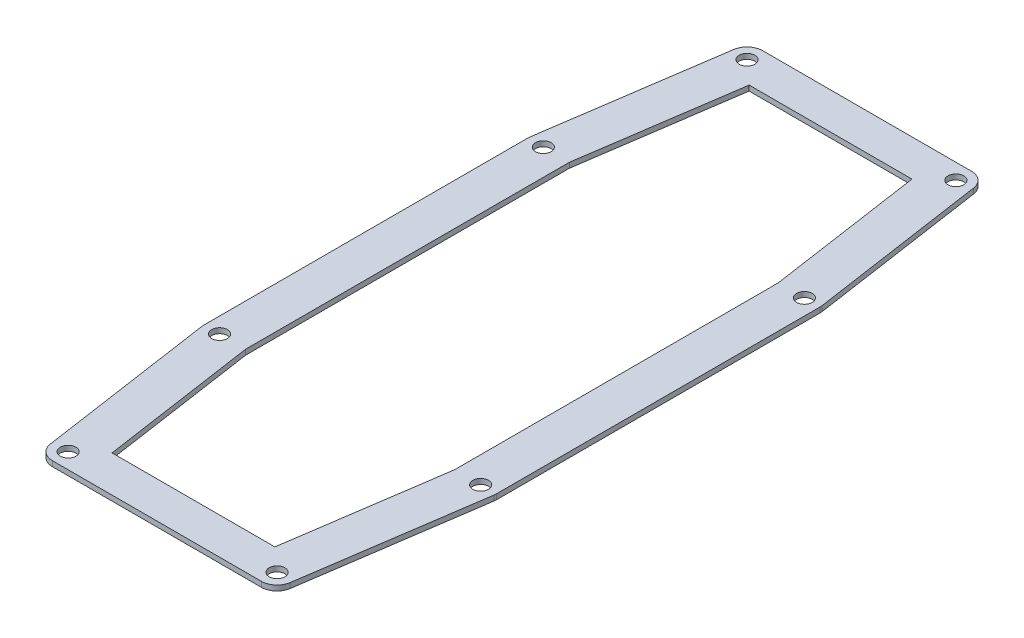
ISO-10303-21;
HEADER;
FILE_DESCRIPTION(('STEP AP214'),'2;1');
FILE_NAME('part.step','',(''),(''),'','','');
FILE_SCHEMA(('AUTOMOTIVE_DESIGN { 1 0 10303 214 1 1 1 1 }'));
ENDSEC;
DATA;
#1=APPLICATION_CONTEXT('core data for automotive mechanical design processes');
#2=APPLICATION_PROTOCOL_DEFINITION('international standard','automotive_design',2000,#1);
#3=PRODUCT_CONTEXT('',#1,'mechanical');
#4=PRODUCT('Part','Part','',(#3));
#5=PRODUCT_RELATED_PRODUCT_CATEGORY('part','',(#4));
#6=PRODUCT_DEFINITION_FORMATION('','',#4);
#7=PRODUCT_DEFINITION_CONTEXT('part definition',#1,'design');
#8=PRODUCT_DEFINITION('design','',#6,#7);
#9=PRODUCT_DEFINITION_SHAPE('','',#8);
#10=(LENGTH_UNIT() NAMED_UNIT(*) SI_UNIT(.MILLI.,.METRE.));
#11=(NAMED_UNIT(*) PLANE_ANGLE_UNIT() SI_UNIT($,.RADIAN.));
#12=(NAMED_UNIT(*) SI_UNIT($,.STERADIAN.) SOLID_ANGLE_UNIT());
#13=UNCERTAINTY_MEASURE_WITH_UNIT(LENGTH_MEASURE(1.E-05),#10,'distance_accuracy_value','');
#14=(GEOMETRIC_REPRESENTATION_CONTEXT(3) GLOBAL_UNCERTAINTY_ASSIGNED_CONTEXT((#13)) GLOBAL_UNIT_ASSIGNED_CONTEXT((#10,
#11,#12)) REPRESENTATION_CONTEXT('',''));
#15=CARTESIAN_POINT('',(0.,0.,0.));
#16=DIRECTION('',(0.,0.,1.));
#17=DIRECTION('',(1.,0.,0.));
#18=AXIS2_PLACEMENT_3D('',#15,#16,#17);
#19=CARTESIAN_POINT('',(45.,1.,34.));
#20=DIRECTION('',(0.,-1.,0.));
#21=DIRECTION('',(0.,0.,-1.));
#22=AXIS2_PLACEMENT_3D('',#19,#20,#21);
#23=PLANE('',#22);
#24=CARTESIAN_POINT('',(45.,1.,34.));
#25=DIRECTION('',(0.,1.,0.));
#26=DIRECTION('',(0.,0.,1.));
#27=AXIS2_PLACEMENT_3D('',#24,#25,#26);
#28=CIRCLE('',#27,1.5);
#29=CARTESIAN_POINT('',(45.,1.,35.5));
#30=VERTEX_POINT('',#29);
#31=EDGE_CURVE('E262',#30,#30,#28,.T.);
#32=ORIENTED_EDGE('',*,*,#31,.F.);
#33=EDGE_LOOP('',(#32));
#34=FACE_BOUND('',#33,.T.);
#35=CARTESIAN_POINT('',(5.00000000000002,1.,34.));
#36=DIRECTION('',(0.,1.,0.));
#37=DIRECTION('',(0.,0.,1.));
#38=AXIS2_PLACEMENT_3D('',#35,#36,#37);
#39=CIRCLE('',#38,1.5);
#40=CARTESIAN_POINT('',(5.00000000000002,1.,35.5));
#41=VERTEX_POINT('',#40);
#42=EDGE_CURVE('E268',#41,#41,#39,.T.);
#43=ORIENTED_EDGE('',*,*,#42,.F.);
#44=EDGE_LOOP('',(#43));
#45=FACE_BOUND('',#44,.T.);
#46=CARTESIAN_POINT('',(45.,1.,-96.));
#47=DIRECTION('',(0.,1.,0.));
#48=DIRECTION('',(0.,0.,1.));
#49=AXIS2_PLACEMENT_3D('',#46,#47,#48);
#50=CIRCLE('',#49,1.5);
#51=CARTESIAN_POINT('',(45.,1.,-94.5));
#52=VERTEX_POINT('',#51);
#53=EDGE_CURVE('E274',#52,#52,#50,.T.);
#54=ORIENTED_EDGE('',*,*,#53,.F.);
#55=EDGE_LOOP('',(#54));
#56=FACE_BOUND('',#55,.T.);
#57=CARTESIAN_POINT('',(5.,1.,-96.));
#58=DIRECTION('',(0.,1.,0.));
#59=DIRECTION('',(0.,0.,1.));
#60=AXIS2_PLACEMENT_3D('',#57,#58,#59);
#61=CIRCLE('',#60,1.5);
#62=CARTESIAN_POINT('',(5.,1.,-94.5));
#63=VERTEX_POINT('',#62);
#64=EDGE_CURVE('E280',#63,#63,#61,.T.);
#65=ORIENTED_EDGE('',*,*,#64,.F.);
#66=EDGE_LOOP('',(#65));
#67=FACE_BOUND('',#66,.T.);
#68=CARTESIAN_POINT('',(50.,1.,0.));
#69=DIRECTION('',(0.,1.,0.));
#70=DIRECTION('',(0.,0.,1.));
#71=AXIS2_PLACEMENT_3D('',#68,#69,#70);
#72=CIRCLE('',#71,1.5);
#73=CARTESIAN_POINT('',(50.,1.,1.5));
#74=VERTEX_POINT('',#73);
#75=EDGE_CURVE('E286',#74,#74,#72,.T.);
#76=ORIENTED_EDGE('',*,*,#75,.F.);
#77=EDGE_LOOP('',(#76));
#78=FACE_BOUND('',#77,.T.);
#79=CARTESIAN_POINT('',(0.,1.,0.));
#80=DIRECTION('',(0.,1.,0.));
#81=DIRECTION('',(0.,0.,1.));
#82=AXIS2_PLACEMENT_3D('',#79,#80,#81);
#83=CIRCLE('',#82,1.5);
#84=CARTESIAN_POINT('',(0.,1.,1.5));
#85=VERTEX_POINT('',#84);
#86=EDGE_CURVE('E292',#85,#85,#83,.T.);
#87=ORIENTED_EDGE('',*,*,#86,.F.);
#88=EDGE_LOOP('',(#87));
#89=FACE_BOUND('',#88,.T.);
#90=CARTESIAN_POINT('',(50.,1.,-62.));
#91=DIRECTION('',(0.,1.,0.));
#92=DIRECTION('',(0.,0.,1.));
#93=AXIS2_PLACEMENT_3D('',#90,#91,#92);
#94=CIRCLE('',#93,1.5);
#95=CARTESIAN_POINT('',(50.,1.,-60.5));
#96=VERTEX_POINT('',#95);
#97=EDGE_CURVE('E298',#96,#96,#94,.T.);
#98=ORIENTED_EDGE('',*,*,#97,.F.);
#99=EDGE_LOOP('',(#98));
#100=FACE_BOUND('',#99,.T.);
#101=CARTESIAN_POINT('',(0.,1.,-62.));
#102=DIRECTION('',(0.,1.,0.));
#103=DIRECTION('',(0.,0.,1.));
#104=AXIS2_PLACEMENT_3D('',#101,#102,#103);
#105=CIRCLE('',#104,1.5);
#106=CARTESIAN_POINT('',(0.,1.,-60.5));
#107=VERTEX_POINT('',#106);
#108=EDGE_CURVE('E304',#107,#107,#105,.T.);
#109=ORIENTED_EDGE('',*,*,#108,.F.);
#110=EDGE_LOOP('',(#109));
#111=FACE_BOUND('',#110,.T.);
#112=CARTESIAN_POINT('',(45.,1.,34.));
#113=DIRECTION('',(0.,1.,0.));
#114=DIRECTION('',(0.,0.,-1.));
#115=AXIS2_PLACEMENT_3D('',#112,#113,#114);
#116=CIRCLE('',#115,2.99999999999999);
#117=CARTESIAN_POINT('',(45.,1.,37.));
#118=VERTEX_POINT('',#117);
#119=CARTESIAN_POINT('',(47.9680774060946,1.,34.4364819714845));
#120=VERTEX_POINT('',#119);
#121=EDGE_CURVE('E310',#118,#120,#116,.T.);
#122=ORIENTED_EDGE('',*,*,#121,.T.);
#123=DIRECTION('',(0.145493990494832,0.,-0.989359135364853));
#124=VECTOR('',#123,1.);
#125=CARTESIAN_POINT('',(52.9680774060946,1.,0.436481971484495));
#126=LINE('',#125,#124);
#127=CARTESIAN_POINT('',(52.9680774060946,1.,0.436481971484495));
#128=VERTEX_POINT('',#127);
#129=EDGE_CURVE('E313',#120,#128,#126,.T.);
#130=ORIENTED_EDGE('',*,*,#129,.T.);
#131=CARTESIAN_POINT('',(50.,1.,0.));
#132=DIRECTION('',(0.,1.,0.));
#133=DIRECTION('',(0.,0.,-1.));
#134=AXIS2_PLACEMENT_3D('',#131,#132,#133);
#135=CIRCLE('',#134,3.);
#136=CARTESIAN_POINT('',(53.,1.,0.));
#137=VERTEX_POINT('',#136);
#138=EDGE_CURVE('E316',#128,#137,#135,.T.);
#139=ORIENTED_EDGE('',*,*,#138,.T.);
#140=DIRECTION('',(0.,0.,-1.));
#141=VECTOR('',#140,1.);
#142=CARTESIAN_POINT('',(53.,1.,-62.));
#143=LINE('',#142,#141);
#144=CARTESIAN_POINT('',(53.,1.,-62.));
#145=VERTEX_POINT('',#144);
#146=EDGE_CURVE('E318',#137,#145,#143,.T.);
#147=ORIENTED_EDGE('',*,*,#146,.T.);
#148=CARTESIAN_POINT('',(50.,1.,-62.));
#149=DIRECTION('',(0.,1.,0.));
#150=DIRECTION('',(0.,0.,-1.));
#151=AXIS2_PLACEMENT_3D('',#148,#149,#150);
#152=CIRCLE('',#151,2.99999999999999);
#153=CARTESIAN_POINT('',(52.9680774060946,1.,-62.4364819714845));
#154=VERTEX_POINT('',#153);
#155=EDGE_CURVE('E320',#145,#154,#152,.T.);
#156=ORIENTED_EDGE('',*,*,#155,.T.);
#157=DIRECTION('',(-0.145493990494831,0.,-0.989359135364853));
#158=VECTOR('',#157,1.);
#159=CARTESIAN_POINT('',(47.9680774060946,1.,-96.4364819714845));
#160=LINE('',#159,#158);
#161=CARTESIAN_POINT('',(47.9680774060946,1.,-96.4364819714845));
#162=VERTEX_POINT('',#161);
#163=EDGE_CURVE('E322',#154,#162,#160,.T.);
#164=ORIENTED_EDGE('',*,*,#163,.T.);
#165=CARTESIAN_POINT('',(45.,1.,-96.));
#166=DIRECTION('',(0.,1.,0.));
#167=DIRECTION('',(0.,0.,-1.));
#168=AXIS2_PLACEMENT_3D('',#165,#166,#167);
#169=CIRCLE('',#168,3.);
#170=CARTESIAN_POINT('',(45.,1.,-99.));
#171=VERTEX_POINT('',#170);
#172=EDGE_CURVE('E324',#162,#171,#169,.T.);
#173=ORIENTED_EDGE('',*,*,#172,.T.);
#174=DIRECTION('',(-1.,0.,0.));
#175=VECTOR('',#174,1.);
#176=CARTESIAN_POINT('',(5.,1.,-99.));
#177=LINE('',#176,#175);
#178=CARTESIAN_POINT('',(5.,1.,-99.));
#179=VERTEX_POINT('',#178);
#180=EDGE_CURVE('E326',#171,#179,#177,.T.);
#181=ORIENTED_EDGE('',*,*,#180,.T.);
#182=CARTESIAN_POINT('',(5.,1.,-96.));
#183=DIRECTION('',(0.,1.,0.));
#184=DIRECTION('',(0.,0.,1.));
#185=AXIS2_PLACEMENT_3D('',#182,#183,#184);
#186=CIRCLE('',#185,3.00000000000001);
#187=CARTESIAN_POINT('',(2.03192259390543,1.,-96.4364819714845));
#188=VERTEX_POINT('',#187);
#189=EDGE_CURVE('E328',#179,#188,#186,.T.);
#190=ORIENTED_EDGE('',*,*,#189,.T.);
#191=DIRECTION('',(-0.145493990494831,0.,0.989359135364853));
#192=VECTOR('',#191,1.);
#193=CARTESIAN_POINT('',(2.03192259390544,1.,-96.4364819714845));
#194=LINE('',#193,#192);
#195=CARTESIAN_POINT('',(-2.96807740609456,1.,-62.4364819714845));
#196=VERTEX_POINT('',#195);
#197=EDGE_CURVE('E330',#188,#196,#194,.T.);
#198=ORIENTED_EDGE('',*,*,#197,.T.);
#199=CARTESIAN_POINT('',(0.,1.,-62.));
#200=DIRECTION('',(0.,1.,0.));
#201=DIRECTION('',(0.,0.,1.));
#202=AXIS2_PLACEMENT_3D('',#199,#200,#201);
#203=CIRCLE('',#202,3.);
#204=CARTESIAN_POINT('',(-3.,1.,-62.));
#205=VERTEX_POINT('',#204);
#206=EDGE_CURVE('E332',#196,#205,#203,.T.);
#207=ORIENTED_EDGE('',*,*,#206,.T.);
#208=DIRECTION('',(0.,0.,1.));
#209=VECTOR('',#208,1.);
#210=CARTESIAN_POINT('',(-3.,1.,-62.));
#211=LINE('',#210,#209);
#212=CARTESIAN_POINT('',(-3.,1.,0.));
#213=VERTEX_POINT('',#212);
#214=EDGE_CURVE('E334',#205,#213,#211,.T.);
#215=ORIENTED_EDGE('',*,*,#214,.T.);
#216=CARTESIAN_POINT('',(0.,1.,0.));
#217=DIRECTION('',(0.,1.,0.));
#218=DIRECTION('',(0.,0.,1.));
#219=AXIS2_PLACEMENT_3D('',#216,#217,#218);
#220=CIRCLE('',#219,3.);
#221=CARTESIAN_POINT('',(-2.96807740609456,1.,0.436481971484493));
#222=VERTEX_POINT('',#221);
#223=EDGE_CURVE('E336',#213,#222,#220,.T.);
#224=ORIENTED_EDGE('',*,*,#223,.T.);
#225=DIRECTION('',(0.145493990494832,0.,0.989359135364853));
#226=VECTOR('',#225,1.);
#227=CARTESIAN_POINT('',(-2.96807740609456,1.,0.436481971484495));
#228=LINE('',#227,#226);
#229=CARTESIAN_POINT('',(2.03192259390546,1.,34.4364819714845));
#230=VERTEX_POINT('',#229);
#231=EDGE_CURVE('E338',#222,#230,#228,.T.);
#232=ORIENTED_EDGE('',*,*,#231,.T.);
#233=CARTESIAN_POINT('',(5.00000000000002,1.,34.));
#234=DIRECTION('',(0.,1.,0.));
#235=DIRECTION('',(0.,0.,1.));
#236=AXIS2_PLACEMENT_3D('',#233,#234,#235);
#237=CIRCLE('',#236,3.);
#238=CARTESIAN_POINT('',(5.00000000000002,1.,37.));
#239=VERTEX_POINT('',#238);
#240=EDGE_CURVE('E340',#230,#239,#237,.T.);
#241=ORIENTED_EDGE('',*,*,#240,.T.);
#242=DIRECTION('',(1.,0.,0.));
#243=VECTOR('',#242,1.);
#244=CARTESIAN_POINT('',(5.00000000000002,1.,37.));
#245=LINE('',#244,#243);
#246=EDGE_CURVE('E342',#239,#118,#245,.T.);
#247=ORIENTED_EDGE('',*,*,#246,.T.);
#248=EDGE_LOOP('',(#122,#130,#139,#147,#156,#164,#173,#181,#190,#198,#207,#215,#224,#232,#241,#247));
#249=FACE_BOUND('',#248,.T.);
#250=DIRECTION('',(-1.,0.,0.));
#251=VECTOR('',#250,1.);
#252=CARTESIAN_POINT('',(9.41176470588236,1.,-92.));
#253=LINE('',#252,#251);
#254=CARTESIAN_POINT('',(40.5882352941176,1.,-92.));
#255=VERTEX_POINT('',#254);
#256=CARTESIAN_POINT('',(9.41176470588236,1.,-92.));
#257=VERTEX_POINT('',#256);
#258=EDGE_CURVE('E197',#255,#257,#253,.T.);
#259=ORIENTED_EDGE('',*,*,#258,.F.);
#260=DIRECTION('',(-0.145493990494832,0.,-0.989359135364853));
#261=VECTOR('',#260,1.);
#262=CARTESIAN_POINT('',(40.5882352941176,1.,-92.));
#263=LINE('',#262,#261);
#264=CARTESIAN_POINT('',(45.,1.,-62.));
#265=VERTEX_POINT('',#264);
#266=EDGE_CURVE('E230',#265,#255,#263,.T.);
#267=ORIENTED_EDGE('',*,*,#266,.F.);
#268=DIRECTION('',(0.,0.,-1.));
#269=VECTOR('',#268,1.);
#270=CARTESIAN_POINT('',(45.,1.,-62.));
#271=LINE('',#270,#269);
#272=CARTESIAN_POINT('',(45.,1.,0.));
#273=VERTEX_POINT('',#272);
#274=EDGE_CURVE('E228',#273,#265,#271,.T.);
#275=ORIENTED_EDGE('',*,*,#274,.F.);
#276=DIRECTION('',(0.145493990494831,0.,-0.989359135364853));
#277=VECTOR('',#276,1.);
#278=CARTESIAN_POINT('',(45.,1.,0.));
#279=LINE('',#278,#277);
#280=CARTESIAN_POINT('',(40.5882352941176,1.,30.));
#281=VERTEX_POINT('',#280);
#282=EDGE_CURVE('E226',#281,#273,#279,.T.);
#283=ORIENTED_EDGE('',*,*,#282,.F.);
#284=DIRECTION('',(1.,0.,0.));
#285=VECTOR('',#284,1.);
#286=CARTESIAN_POINT('',(9.41176470588238,1.,30.));
#287=LINE('',#286,#285);
#288=CARTESIAN_POINT('',(9.41176470588238,1.,30.));
#289=VERTEX_POINT('',#288);
#290=EDGE_CURVE('E224',#289,#281,#287,.T.);
#291=ORIENTED_EDGE('',*,*,#290,.F.);
#292=DIRECTION('',(0.145493990494832,0.,0.989359135364853));
#293=VECTOR('',#292,1.);
#294=CARTESIAN_POINT('',(5.00000000000002,1.,0.));
#295=LINE('',#294,#293);
#296=CARTESIAN_POINT('',(5.00000000000002,1.,0.));
#297=VERTEX_POINT('',#296);
#298=EDGE_CURVE('E220',#297,#289,#295,.T.);
#299=ORIENTED_EDGE('',*,*,#298,.F.);
#300=DIRECTION('',(0.,0.,1.));
#301=VECTOR('',#300,1.);
#302=CARTESIAN_POINT('',(5.,1.,-62.));
#303=LINE('',#302,#301);
#304=CARTESIAN_POINT('',(5.,1.,-62.));
#305=VERTEX_POINT('',#304);
#306=EDGE_CURVE('E218',#305,#297,#303,.T.);
#307=ORIENTED_EDGE('',*,*,#306,.F.);
#308=DIRECTION('',(-0.145493990494831,0.,0.989359135364853));
#309=VECTOR('',#308,1.);
#310=CARTESIAN_POINT('',(9.41176470588236,1.,-92.));
#311=LINE('',#310,#309);
#312=EDGE_CURVE('E205',#257,#305,#311,.T.);
#313=ORIENTED_EDGE('',*,*,#312,.F.);
#314=EDGE_LOOP('',(#259,#267,#275,#283,#291,#299,#307,#313));
#315=FACE_BOUND('',#314,.T.);
#316=ADVANCED_FACE('F36',(#34,#45,#56,#67,#78,#89,#100,#111,#249,#315),#23,.F.);
#317=CARTESIAN_POINT('',(45.,0.,34.));
#318=DIRECTION('',(0.,-1.,0.));
#319=DIRECTION('',(0.,0.,-1.));
#320=AXIS2_PLACEMENT_3D('',#317,#318,#319);
#321=PLANE('',#320);
#322=CARTESIAN_POINT('',(5.00000000000002,0.,34.));
#323=DIRECTION('',(0.,1.,0.));
#324=DIRECTION('',(0.,0.,1.));
#325=AXIS2_PLACEMENT_3D('',#322,#323,#324);
#326=CIRCLE('',#325,1.5);
#327=CARTESIAN_POINT('',(5.00000000000002,0.,35.5));
#328=VERTEX_POINT('',#327);
#329=EDGE_CURVE('E265',#328,#328,#326,.T.);
#330=ORIENTED_EDGE('',*,*,#329,.T.);
#331=EDGE_LOOP('',(#330));
#332=FACE_BOUND('',#331,.T.);
#333=CARTESIAN_POINT('',(5.,0.,-96.));
#334=DIRECTION('',(0.,1.,0.));
#335=DIRECTION('',(0.,0.,1.));
#336=AXIS2_PLACEMENT_3D('',#333,#334,#335);
#337=CIRCLE('',#336,1.5);
#338=CARTESIAN_POINT('',(5.,0.,-94.5));
#339=VERTEX_POINT('',#338);
#340=EDGE_CURVE('E277',#339,#339,#337,.T.);
#341=ORIENTED_EDGE('',*,*,#340,.T.);
#342=EDGE_LOOP('',(#341));
#343=FACE_BOUND('',#342,.T.);
#344=CARTESIAN_POINT('',(0.,0.,0.));
#345=DIRECTION('',(0.,1.,0.));
#346=DIRECTION('',(0.,0.,1.));
#347=AXIS2_PLACEMENT_3D('',#344,#345,#346);
#348=CIRCLE('',#347,1.5);
#349=CARTESIAN_POINT('',(0.,0.,1.5));
#350=VERTEX_POINT('',#349);
#351=EDGE_CURVE('E289',#350,#350,#348,.T.);
#352=ORIENTED_EDGE('',*,*,#351,.T.);
#353=EDGE_LOOP('',(#352));
#354=FACE_BOUND('',#353,.T.);
#355=CARTESIAN_POINT('',(0.,0.,-62.));
#356=DIRECTION('',(0.,1.,0.));
#357=DIRECTION('',(0.,0.,1.));
#358=AXIS2_PLACEMENT_3D('',#355,#356,#357);
#359=CIRCLE('',#358,1.5);
#360=CARTESIAN_POINT('',(0.,0.,-60.5));
#361=VERTEX_POINT('',#360);
#362=EDGE_CURVE('E301',#361,#361,#359,.T.);
#363=ORIENTED_EDGE('',*,*,#362,.T.);
#364=EDGE_LOOP('',(#363));
#365=FACE_BOUND('',#364,.T.);
#366=CARTESIAN_POINT('',(45.,0.,34.));
#367=DIRECTION('',(0.,1.,0.));
#368=DIRECTION('',(0.,0.,-1.));
#369=AXIS2_PLACEMENT_3D('',#366,#367,#368);
#370=CIRCLE('',#369,2.99999999999999);
#371=CARTESIAN_POINT('',(45.,0.,37.));
#372=VERTEX_POINT('',#371);
#373=CARTESIAN_POINT('',(47.9680774060946,0.,34.4364819714845));
#374=VERTEX_POINT('',#373);
#375=EDGE_CURVE('E307',#372,#374,#370,.T.);
#376=ORIENTED_EDGE('',*,*,#375,.F.);
#377=DIRECTION('',(1.,0.,0.));
#378=VECTOR('',#377,1.);
#379=CARTESIAN_POINT('',(5.00000000000002,0.,37.));
#380=LINE('',#379,#378);
#381=CARTESIAN_POINT('',(5.00000000000002,0.,37.));
#382=VERTEX_POINT('',#381);
#383=EDGE_CURVE('E314',#382,#372,#380,.T.);
#384=ORIENTED_EDGE('',*,*,#383,.F.);
#385=CARTESIAN_POINT('',(5.00000000000002,0.,34.));
#386=DIRECTION('',(0.,1.,0.));
#387=DIRECTION('',(0.,0.,1.));
#388=AXIS2_PLACEMENT_3D('',#385,#386,#387);
#389=CIRCLE('',#388,3.);
#390=CARTESIAN_POINT('',(2.03192259390546,0.,34.4364819714845));
#391=VERTEX_POINT('',#390);
#392=EDGE_CURVE('E373',#391,#382,#389,.T.);
#393=ORIENTED_EDGE('',*,*,#392,.F.);
#394=DIRECTION('',(0.145493990494832,0.,0.989359135364853));
#395=VECTOR('',#394,1.);
#396=CARTESIAN_POINT('',(-2.96807740609456,0.,0.436481971484495));
#397=LINE('',#396,#395);
#398=CARTESIAN_POINT('',(-2.96807740609456,0.,0.436481971484493));
#399=VERTEX_POINT('',#398);
#400=EDGE_CURVE('E371',#399,#391,#397,.T.);
#401=ORIENTED_EDGE('',*,*,#400,.F.);
#402=CARTESIAN_POINT('',(0.,0.,0.));
#403=DIRECTION('',(0.,1.,0.));
#404=DIRECTION('',(0.,0.,1.));
#405=AXIS2_PLACEMENT_3D('',#402,#403,#404);
#406=CIRCLE('',#405,3.);
#407=CARTESIAN_POINT('',(-3.,0.,0.));
#408=VERTEX_POINT('',#407);
#409=EDGE_CURVE('E369',#408,#399,#406,.T.);
#410=ORIENTED_EDGE('',*,*,#409,.F.);
#411=DIRECTION('',(0.,0.,1.));
#412=VECTOR('',#411,1.);
#413=CARTESIAN_POINT('',(-3.,0.,-62.));
#414=LINE('',#413,#412);
#415=CARTESIAN_POINT('',(-3.,0.,-62.));
#416=VERTEX_POINT('',#415);
#417=EDGE_CURVE('E367',#416,#408,#414,.T.);
#418=ORIENTED_EDGE('',*,*,#417,.F.);
#419=CARTESIAN_POINT('',(0.,0.,-62.));
#420=DIRECTION('',(0.,1.,0.));
#421=DIRECTION('',(0.,0.,1.));
#422=AXIS2_PLACEMENT_3D('',#419,#420,#421);
#423=CIRCLE('',#422,3.);
#424=CARTESIAN_POINT('',(-2.96807740609456,0.,-62.4364819714845));
#425=VERTEX_POINT('',#424);
#426=EDGE_CURVE('E365',#425,#416,#423,.T.);
#427=ORIENTED_EDGE('',*,*,#426,.F.);
#428=DIRECTION('',(-0.145493990494831,0.,0.989359135364853));
#429=VECTOR('',#428,1.);
#430=CARTESIAN_POINT('',(2.03192259390544,0.,-96.4364819714845));
#431=LINE('',#430,#429);
#432=CARTESIAN_POINT('',(2.03192259390543,0.,-96.4364819714845));
#433=VERTEX_POINT('',#432);
#434=EDGE_CURVE('E363',#433,#425,#431,.T.);
#435=ORIENTED_EDGE('',*,*,#434,.F.);
#436=CARTESIAN_POINT('',(5.,0.,-96.));
#437=DIRECTION('',(0.,1.,0.));
#438=DIRECTION('',(0.,0.,1.));
#439=AXIS2_PLACEMENT_3D('',#436,#437,#438);
#440=CIRCLE('',#439,3.00000000000001);
#441=CARTESIAN_POINT('',(5.,0.,-99.));
#442=VERTEX_POINT('',#441);
#443=EDGE_CURVE('E361',#442,#433,#440,.T.);
#444=ORIENTED_EDGE('',*,*,#443,.F.);
#445=DIRECTION('',(-1.,0.,0.));
#446=VECTOR('',#445,1.);
#447=CARTESIAN_POINT('',(5.,0.,-99.));
#448=LINE('',#447,#446);
#449=CARTESIAN_POINT('',(45.,0.,-99.));
#450=VERTEX_POINT('',#449);
#451=EDGE_CURVE('E359',#450,#442,#448,.T.);
#452=ORIENTED_EDGE('',*,*,#451,.F.);
#453=CARTESIAN_POINT('',(45.,0.,-96.));
#454=DIRECTION('',(0.,1.,0.));
#455=DIRECTION('',(0.,0.,-1.));
#456=AXIS2_PLACEMENT_3D('',#453,#454,#455);
#457=CIRCLE('',#456,3.);
#458=CARTESIAN_POINT('',(47.9680774060946,0.,-96.4364819714845));
#459=VERTEX_POINT('',#458);
#460=EDGE_CURVE('E357',#459,#450,#457,.T.);
#461=ORIENTED_EDGE('',*,*,#460,.F.);
#462=DIRECTION('',(-0.145493990494831,0.,-0.989359135364853));
#463=VECTOR('',#462,1.);
#464=CARTESIAN_POINT('',(47.9680774060946,0.,-96.4364819714845));
#465=LINE('',#464,#463);
#466=CARTESIAN_POINT('',(52.9680774060946,0.,-62.4364819714845));
#467=VERTEX_POINT('',#466);
#468=EDGE_CURVE('E355',#467,#459,#465,.T.);
#469=ORIENTED_EDGE('',*,*,#468,.F.);
#470=CARTESIAN_POINT('',(50.,0.,-62.));
#471=DIRECTION('',(0.,1.,0.));
#472=DIRECTION('',(0.,0.,-1.));
#473=AXIS2_PLACEMENT_3D('',#470,#471,#472);
#474=CIRCLE('',#473,2.99999999999999);
#475=CARTESIAN_POINT('',(53.,0.,-62.));
#476=VERTEX_POINT('',#475);
#477=EDGE_CURVE('E353',#476,#467,#474,.T.);
#478=ORIENTED_EDGE('',*,*,#477,.F.);
#479=DIRECTION('',(0.,0.,-1.));
#480=VECTOR('',#479,1.);
#481=CARTESIAN_POINT('',(53.,0.,-62.));
#482=LINE('',#481,#480);
#483=CARTESIAN_POINT('',(53.,0.,0.));
#484=VERTEX_POINT('',#483);
#485=EDGE_CURVE('E351',#484,#476,#482,.T.);
#486=ORIENTED_EDGE('',*,*,#485,.F.);
#487=CARTESIAN_POINT('',(50.,0.,0.));
#488=DIRECTION('',(0.,1.,0.));
#489=DIRECTION('',(0.,0.,-1.));
#490=AXIS2_PLACEMENT_3D('',#487,#488,#489);
#491=CIRCLE('',#490,3.);
#492=CARTESIAN_POINT('',(52.9680774060946,0.,0.436481971484495));
#493=VERTEX_POINT('',#492);
#494=EDGE_CURVE('E349',#493,#484,#491,.T.);
#495=ORIENTED_EDGE('',*,*,#494,.F.);
#496=DIRECTION('',(0.145493990494832,0.,-0.989359135364853));
#497=VECTOR('',#496,1.);
#498=CARTESIAN_POINT('',(52.9680774060946,0.,0.436481971484495));
#499=LINE('',#498,#497);
#500=EDGE_CURVE('E347',#374,#493,#499,.T.);
#501=ORIENTED_EDGE('',*,*,#500,.F.);
#502=EDGE_LOOP('',(#376,#384,#393,#401,#410,#418,#427,#435,#444,#452,#461,#469,#478,#486,#495,#501));
#503=FACE_BOUND('',#502,.T.);
#504=CARTESIAN_POINT('',(50.,0.,-62.));
#505=DIRECTION('',(0.,1.,0.));
#506=DIRECTION('',(0.,0.,1.));
#507=AXIS2_PLACEMENT_3D('',#504,#505,#506);
#508=CIRCLE('',#507,1.5);
#509=CARTESIAN_POINT('',(50.,0.,-60.5));
#510=VERTEX_POINT('',#509);
#511=EDGE_CURVE('E295',#510,#510,#508,.T.);
#512=ORIENTED_EDGE('',*,*,#511,.T.);
#513=EDGE_LOOP('',(#512));
#514=FACE_BOUND('',#513,.T.);
#515=CARTESIAN_POINT('',(50.,0.,0.));
#516=DIRECTION('',(0.,1.,0.));
#517=DIRECTION('',(0.,0.,1.));
#518=AXIS2_PLACEMENT_3D('',#515,#516,#517);
#519=CIRCLE('',#518,1.5);
#520=CARTESIAN_POINT('',(50.,0.,1.5));
#521=VERTEX_POINT('',#520);
#522=EDGE_CURVE('E283',#521,#521,#519,.T.);
#523=ORIENTED_EDGE('',*,*,#522,.T.);
#524=EDGE_LOOP('',(#523));
#525=FACE_BOUND('',#524,.T.);
#526=CARTESIAN_POINT('',(45.,0.,-96.));
#527=DIRECTION('',(0.,1.,0.));
#528=DIRECTION('',(0.,0.,1.));
#529=AXIS2_PLACEMENT_3D('',#526,#527,#528);
#530=CIRCLE('',#529,1.5);
#531=CARTESIAN_POINT('',(45.,0.,-94.5));
#532=VERTEX_POINT('',#531);
#533=EDGE_CURVE('E271',#532,#532,#530,.T.);
#534=ORIENTED_EDGE('',*,*,#533,.T.);
#535=EDGE_LOOP('',(#534));
#536=FACE_BOUND('',#535,.T.);
#537=CARTESIAN_POINT('',(45.,0.,34.));
#538=DIRECTION('',(0.,1.,0.));
#539=DIRECTION('',(0.,0.,1.));
#540=AXIS2_PLACEMENT_3D('',#537,#538,#539);
#541=CIRCLE('',#540,1.5);
#542=CARTESIAN_POINT('',(45.,0.,35.5));
#543=VERTEX_POINT('',#542);
#544=EDGE_CURVE('E213',#543,#543,#541,.T.);
#545=ORIENTED_EDGE('',*,*,#544,.T.);
#546=EDGE_LOOP('',(#545));
#547=FACE_BOUND('',#546,.T.);
#548=DIRECTION('',(-0.145493990494832,0.,-0.989359135364853));
#549=VECTOR('',#548,1.);
#550=CARTESIAN_POINT('',(40.5882352941176,0.,-92.));
#551=LINE('',#550,#549);
#552=CARTESIAN_POINT('',(45.,0.,-62.));
#553=VERTEX_POINT('',#552);
#554=CARTESIAN_POINT('',(40.5882352941176,0.,-92.));
#555=VERTEX_POINT('',#554);
#556=EDGE_CURVE('E206',#553,#555,#551,.T.);
#557=ORIENTED_EDGE('',*,*,#556,.T.);
#558=DIRECTION('',(-1.,0.,0.));
#559=VECTOR('',#558,1.);
#560=CARTESIAN_POINT('',(9.41176470588236,0.,-92.));
#561=LINE('',#560,#559);
#562=CARTESIAN_POINT('',(9.41176470588236,0.,-92.));
#563=VERTEX_POINT('',#562);
#564=EDGE_CURVE('E59',#555,#563,#561,.T.);
#565=ORIENTED_EDGE('',*,*,#564,.T.);
#566=DIRECTION('',(-0.145493990494831,0.,0.989359135364853));
#567=VECTOR('',#566,1.);
#568=CARTESIAN_POINT('',(9.41176470588236,0.,-92.));
#569=LINE('',#568,#567);
#570=CARTESIAN_POINT('',(5.,0.,-62.));
#571=VERTEX_POINT('',#570);
#572=EDGE_CURVE('E212',#563,#571,#569,.T.);
#573=ORIENTED_EDGE('',*,*,#572,.T.);
#574=DIRECTION('',(0.,0.,1.));
#575=VECTOR('',#574,1.);
#576=CARTESIAN_POINT('',(5.,0.,-62.));
#577=LINE('',#576,#575);
#578=CARTESIAN_POINT('',(5.00000000000002,0.,0.));
#579=VERTEX_POINT('',#578);
#580=EDGE_CURVE('E234',#571,#579,#577,.T.);
#581=ORIENTED_EDGE('',*,*,#580,.T.);
#582=DIRECTION('',(0.145493990494832,0.,0.989359135364853));
#583=VECTOR('',#582,1.);
#584=CARTESIAN_POINT('',(5.00000000000002,0.,0.));
#585=LINE('',#584,#583);
#586=CARTESIAN_POINT('',(9.41176470588238,0.,30.));
#587=VERTEX_POINT('',#586);
#588=EDGE_CURVE('E237',#579,#587,#585,.T.);
#589=ORIENTED_EDGE('',*,*,#588,.T.);
#590=DIRECTION('',(1.,0.,0.));
#591=VECTOR('',#590,1.);
#592=CARTESIAN_POINT('',(9.41176470588238,0.,30.));
#593=LINE('',#592,#591);
#594=CARTESIAN_POINT('',(40.5882352941176,0.,30.));
#595=VERTEX_POINT('',#594);
#596=EDGE_CURVE('E240',#587,#595,#593,.T.);
#597=ORIENTED_EDGE('',*,*,#596,.T.);
#598=DIRECTION('',(0.145493990494831,0.,-0.989359135364853));
#599=VECTOR('',#598,1.);
#600=CARTESIAN_POINT('',(45.,0.,0.));
#601=LINE('',#600,#599);
#602=CARTESIAN_POINT('',(45.,0.,0.));
#603=VERTEX_POINT('',#602);
#604=EDGE_CURVE('E243',#595,#603,#601,.T.);
#605=ORIENTED_EDGE('',*,*,#604,.T.);
#606=DIRECTION('',(0.,0.,-1.));
#607=VECTOR('',#606,1.);
#608=CARTESIAN_POINT('',(45.,0.,-62.));
#609=LINE('',#608,#607);
#610=EDGE_CURVE('E246',#603,#553,#609,.T.);
#611=ORIENTED_EDGE('',*,*,#610,.T.);
#612=EDGE_LOOP('',(#557,#565,#573,#581,#589,#597,#605,#611));
#613=FACE_BOUND('',#612,.T.);
#614=ADVANCED_FACE('F427',(#332,#343,#354,#365,#503,#514,#525,#536,#547,#613),#321,.T.);
#615=CARTESIAN_POINT('',(45.,1.,34.));
#616=DIRECTION('',(0.,-1.,0.));
#617=DIRECTION('',(0.,0.,-1.));
#618=AXIS2_PLACEMENT_3D('',#615,#616,#617);
#619=CYLINDRICAL_SURFACE('',#618,2.99999999999999);
#620=ORIENTED_EDGE('',*,*,#375,.T.);
#621=DIRECTION('',(0.,-1.,0.));
#622=VECTOR('',#621,1.);
#623=CARTESIAN_POINT('',(47.9680774060946,1.,34.4364819714845));
#624=LINE('',#623,#622);
#625=EDGE_CURVE('E11',#120,#374,#624,.T.);
#626=ORIENTED_EDGE('',*,*,#625,.F.);
#627=ORIENTED_EDGE('',*,*,#121,.F.);
#628=DIRECTION('',(0.,-1.,0.));
#629=VECTOR('',#628,1.);
#630=CARTESIAN_POINT('',(45.,1.,37.));
#631=LINE('',#630,#629);
#632=EDGE_CURVE('E344',#118,#372,#631,.T.);
#633=ORIENTED_EDGE('',*,*,#632,.T.);
#634=EDGE_LOOP('',(#620,#626,#627,#633));
#635=FACE_BOUND('',#634,.T.);
#636=ADVANCED_FACE('F38',(#635),#619,.T.);
#637=CARTESIAN_POINT('',(52.9680774060946,1.,0.436481971484495));
#638=DIRECTION('',(-0.989359135364853,0.,-0.145493990494832));
#639=DIRECTION('',(-0.145493990494832,0.,0.989359135364853));
#640=AXIS2_PLACEMENT_3D('',#637,#638,#639);
#641=PLANE('',#640);
#642=ORIENTED_EDGE('',*,*,#500,.T.);
#643=DIRECTION('',(0.,-1.,0.));
#644=VECTOR('',#643,1.);
#645=CARTESIAN_POINT('',(52.9680774060946,1.,0.436481971484495));
#646=LINE('',#645,#644);
#647=EDGE_CURVE('E44',#128,#493,#646,.T.);
#648=ORIENTED_EDGE('',*,*,#647,.F.);
#649=ORIENTED_EDGE('',*,*,#129,.F.);
#650=ORIENTED_EDGE('',*,*,#625,.T.);
#651=EDGE_LOOP('',(#642,#648,#649,#650));
#652=FACE_BOUND('',#651,.T.);
#653=ADVANCED_FACE('F444',(#652),#641,.F.);
#654=CARTESIAN_POINT('',(50.,1.,0.));
#655=DIRECTION('',(0.,-1.,0.));
#656=DIRECTION('',(0.,0.,-1.));
#657=AXIS2_PLACEMENT_3D('',#654,#655,#656);
#658=CYLINDRICAL_SURFACE('',#657,3.);
#659=ORIENTED_EDGE('',*,*,#494,.T.);
#660=DIRECTION('',(0.,-1.,0.));
#661=VECTOR('',#660,1.);
#662=CARTESIAN_POINT('',(53.,1.,0.));
#663=LINE('',#662,#661);
#664=EDGE_CURVE('E414',#137,#484,#663,.T.);
#665=ORIENTED_EDGE('',*,*,#664,.F.);
#666=ORIENTED_EDGE('',*,*,#138,.F.);
#667=ORIENTED_EDGE('',*,*,#647,.T.);
#668=EDGE_LOOP('',(#659,#665,#666,#667));
#669=FACE_BOUND('',#668,.T.);
#670=ADVANCED_FACE('F421',(#669),#658,.T.);
#671=CARTESIAN_POINT('',(53.,1.,-62.));
#672=DIRECTION('',(-1.,0.,0.));
#673=DIRECTION('',(0.,0.,1.));
#674=AXIS2_PLACEMENT_3D('',#671,#672,#673);
#675=PLANE('',#674);
#676=ORIENTED_EDGE('',*,*,#485,.T.);
#677=DIRECTION('',(0.,-1.,0.));
#678=VECTOR('',#677,1.);
#679=CARTESIAN_POINT('',(53.,1.,-62.));
#680=LINE('',#679,#678);
#681=EDGE_CURVE('E411',#145,#476,#680,.T.);
#682=ORIENTED_EDGE('',*,*,#681,.F.);
#683=ORIENTED_EDGE('',*,*,#146,.F.);
#684=ORIENTED_EDGE('',*,*,#664,.T.);
#685=EDGE_LOOP('',(#676,#682,#683,#684));
#686=FACE_BOUND('',#685,.T.);
#687=ADVANCED_FACE('F433',(#686),#675,.F.);
#688=CARTESIAN_POINT('',(50.,1.,-62.));
#689=DIRECTION('',(0.,-1.,0.));
#690=DIRECTION('',(0.,0.,-1.));
#691=AXIS2_PLACEMENT_3D('',#688,#689,#690);
#692=CYLINDRICAL_SURFACE('',#691,2.99999999999999);
#693=ORIENTED_EDGE('',*,*,#477,.T.);
#694=DIRECTION('',(0.,-1.,0.));
#695=VECTOR('',#694,1.);
#696=CARTESIAN_POINT('',(52.9680774060946,1.,-62.4364819714845));
#697=LINE('',#696,#695);
#698=EDGE_CURVE('E408',#154,#467,#697,.T.);
#699=ORIENTED_EDGE('',*,*,#698,.F.);
#700=ORIENTED_EDGE('',*,*,#155,.F.);
#701=ORIENTED_EDGE('',*,*,#681,.T.);
#702=EDGE_LOOP('',(#693,#699,#700,#701));
#703=FACE_BOUND('',#702,.T.);
#704=ADVANCED_FACE('F437',(#703),#692,.T.);
#705=CARTESIAN_POINT('',(47.9680774060946,1.,-96.4364819714845));
#706=DIRECTION('',(-0.989359135364853,0.,0.145493990494831));
#707=DIRECTION('',(0.145493990494831,0.,0.989359135364853));
#708=AXIS2_PLACEMENT_3D('',#705,#706,#707);
#709=PLANE('',#708);
#710=ORIENTED_EDGE('',*,*,#468,.T.);
#711=DIRECTION('',(0.,-1.,0.));
#712=VECTOR('',#711,1.);
#713=CARTESIAN_POINT('',(47.9680774060946,1.,-96.4364819714845));
#714=LINE('',#713,#712);
#715=EDGE_CURVE('E405',#162,#459,#714,.T.);
#716=ORIENTED_EDGE('',*,*,#715,.F.);
#717=ORIENTED_EDGE('',*,*,#163,.F.);
#718=ORIENTED_EDGE('',*,*,#698,.T.);
#719=EDGE_LOOP('',(#710,#716,#717,#718));
#720=FACE_BOUND('',#719,.T.);
#721=ADVANCED_FACE('F497',(#720),#709,.F.);
#722=CARTESIAN_POINT('',(45.,1.,-96.));
#723=DIRECTION('',(0.,-1.,0.));
#724=DIRECTION('',(0.,0.,-1.));
#725=AXIS2_PLACEMENT_3D('',#722,#723,#724);
#726=CYLINDRICAL_SURFACE('',#725,3.);
#727=ORIENTED_EDGE('',*,*,#460,.T.);
#728=DIRECTION('',(0.,-1.,0.));
#729=VECTOR('',#728,1.);
#730=CARTESIAN_POINT('',(45.,1.,-99.));
#731=LINE('',#730,#729);
#732=EDGE_CURVE('E402',#171,#450,#731,.T.);
#733=ORIENTED_EDGE('',*,*,#732,.F.);
#734=ORIENTED_EDGE('',*,*,#172,.F.);
#735=ORIENTED_EDGE('',*,*,#715,.T.);
#736=EDGE_LOOP('',(#727,#733,#734,#735));
#737=FACE_BOUND('',#736,.T.);
#738=ADVANCED_FACE('F494',(#737),#726,.T.);
#739=CARTESIAN_POINT('',(5.,1.,-99.));
#740=DIRECTION('',(0.,0.,1.));
#741=DIRECTION('',(1.,0.,0.));
#742=AXIS2_PLACEMENT_3D('',#739,#740,#741);
#743=PLANE('',#742);
#744=ORIENTED_EDGE('',*,*,#451,.T.);
#745=DIRECTION('',(0.,-1.,0.));
#746=VECTOR('',#745,1.);
#747=CARTESIAN_POINT('',(5.,1.,-99.));
#748=LINE('',#747,#746);
#749=EDGE_CURVE('E399',#179,#442,#748,.T.);
#750=ORIENTED_EDGE('',*,*,#749,.F.);
#751=ORIENTED_EDGE('',*,*,#180,.F.);
#752=ORIENTED_EDGE('',*,*,#732,.T.);
#753=EDGE_LOOP('',(#744,#750,#751,#752));
#754=FACE_BOUND('',#753,.T.);
#755=ADVANCED_FACE('F490',(#754),#743,.F.);
#756=CARTESIAN_POINT('',(5.,1.,-96.));
#757=DIRECTION('',(0.,-1.,0.));
#758=DIRECTION('',(0.,0.,-1.));
#759=AXIS2_PLACEMENT_3D('',#756,#757,#758);
#760=CYLINDRICAL_SURFACE('',#759,3.00000000000001);
#761=ORIENTED_EDGE('',*,*,#443,.T.);
#762=DIRECTION('',(0.,-1.,0.));
#763=VECTOR('',#762,1.);
#764=CARTESIAN_POINT('',(2.03192259390543,1.,-96.4364819714845));
#765=LINE('',#764,#763);
#766=EDGE_CURVE('E396',#188,#433,#765,.T.);
#767=ORIENTED_EDGE('',*,*,#766,.F.);
#768=ORIENTED_EDGE('',*,*,#189,.F.);
#769=ORIENTED_EDGE('',*,*,#749,.T.);
#770=EDGE_LOOP('',(#761,#767,#768,#769));
#771=FACE_BOUND('',#770,.T.);
#772=ADVANCED_FACE('F486',(#771),#760,.T.);
#773=CARTESIAN_POINT('',(2.03192259390544,1.,-96.4364819714845));
#774=DIRECTION('',(0.989359135364853,0.,0.145493990494831));
#775=DIRECTION('',(0.145493990494831,0.,-0.989359135364853));
#776=AXIS2_PLACEMENT_3D('',#773,#774,#775);
#777=PLANE('',#776);
#778=ORIENTED_EDGE('',*,*,#434,.T.);
#779=DIRECTION('',(0.,-1.,0.));
#780=VECTOR('',#779,1.);
#781=CARTESIAN_POINT('',(-2.96807740609456,1.,-62.4364819714845));
#782=LINE('',#781,#780);
#783=EDGE_CURVE('E393',#196,#425,#782,.T.);
#784=ORIENTED_EDGE('',*,*,#783,.F.);
#785=ORIENTED_EDGE('',*,*,#197,.F.);
#786=ORIENTED_EDGE('',*,*,#766,.T.);
#787=EDGE_LOOP('',(#778,#784,#785,#786));
#788=FACE_BOUND('',#787,.T.);
#789=ADVANCED_FACE('F481',(#788),#777,.F.);
#790=CARTESIAN_POINT('',(0.,1.,-62.));
#791=DIRECTION('',(0.,-1.,0.));
#792=DIRECTION('',(0.,0.,-1.));
#793=AXIS2_PLACEMENT_3D('',#790,#791,#792);
#794=CYLINDRICAL_SURFACE('',#793,3.);
#795=ORIENTED_EDGE('',*,*,#426,.T.);
#796=DIRECTION('',(0.,-1.,0.));
#797=VECTOR('',#796,1.);
#798=CARTESIAN_POINT('',(-3.,1.,-62.));
#799=LINE('',#798,#797);
#800=EDGE_CURVE('E390',#205,#416,#799,.T.);
#801=ORIENTED_EDGE('',*,*,#800,.F.);
#802=ORIENTED_EDGE('',*,*,#206,.F.);
#803=ORIENTED_EDGE('',*,*,#783,.T.);
#804=EDGE_LOOP('',(#795,#801,#802,#803));
#805=FACE_BOUND('',#804,.T.);
#806=ADVANCED_FACE('F475',(#805),#794,.T.);
#807=CARTESIAN_POINT('',(-3.,1.,-62.));
#808=DIRECTION('',(1.,0.,0.));
#809=DIRECTION('',(0.,0.,-1.));
#810=AXIS2_PLACEMENT_3D('',#807,#808,#809);
#811=PLANE('',#810);
#812=ORIENTED_EDGE('',*,*,#417,.T.);
#813=DIRECTION('',(0.,-1.,0.));
#814=VECTOR('',#813,1.);
#815=CARTESIAN_POINT('',(-3.,1.,0.));
#816=LINE('',#815,#814);
#817=EDGE_CURVE('E387',#213,#408,#816,.T.);
#818=ORIENTED_EDGE('',*,*,#817,.F.);
#819=ORIENTED_EDGE('',*,*,#214,.F.);
#820=ORIENTED_EDGE('',*,*,#800,.T.);
#821=EDGE_LOOP('',(#812,#818,#819,#820));
#822=FACE_BOUND('',#821,.T.);
#823=ADVANCED_FACE('F471',(#822),#811,.F.);
#824=CARTESIAN_POINT('',(0.,1.,0.));
#825=DIRECTION('',(0.,-1.,0.));
#826=DIRECTION('',(0.,0.,-1.));
#827=AXIS2_PLACEMENT_3D('',#824,#825,#826);
#828=CYLINDRICAL_SURFACE('',#827,3.);
#829=ORIENTED_EDGE('',*,*,#409,.T.);
#830=DIRECTION('',(0.,-1.,0.));
#831=VECTOR('',#830,1.);
#832=CARTESIAN_POINT('',(-2.96807740609456,1.,0.436481971484493));
#833=LINE('',#832,#831);
#834=EDGE_CURVE('E384',#222,#399,#833,.T.);
#835=ORIENTED_EDGE('',*,*,#834,.F.);
#836=ORIENTED_EDGE('',*,*,#223,.F.);
#837=ORIENTED_EDGE('',*,*,#817,.T.);
#838=EDGE_LOOP('',(#829,#835,#836,#837));
#839=FACE_BOUND('',#838,.T.);
#840=ADVANCED_FACE('F466',(#839),#828,.T.);
#841=CARTESIAN_POINT('',(-2.96807740609456,1.,0.436481971484495));
#842=DIRECTION('',(0.989359135364853,0.,-0.145493990494832));
#843=DIRECTION('',(-0.145493990494832,0.,-0.989359135364853));
#844=AXIS2_PLACEMENT_3D('',#841,#842,#843);
#845=PLANE('',#844);
#846=ORIENTED_EDGE('',*,*,#400,.T.);
#847=DIRECTION('',(0.,-1.,0.));
#848=VECTOR('',#847,1.);
#849=CARTESIAN_POINT('',(2.03192259390546,1.,34.4364819714845));
#850=LINE('',#849,#848);
#851=EDGE_CURVE('E381',#230,#391,#850,.T.);
#852=ORIENTED_EDGE('',*,*,#851,.F.);
#853=ORIENTED_EDGE('',*,*,#231,.F.);
#854=ORIENTED_EDGE('',*,*,#834,.T.);
#855=EDGE_LOOP('',(#846,#852,#853,#854));
#856=FACE_BOUND('',#855,.T.);
#857=ADVANCED_FACE('F460',(#856),#845,.F.);
#858=CARTESIAN_POINT('',(5.00000000000002,1.,34.));
#859=DIRECTION('',(0.,-1.,0.));
#860=DIRECTION('',(0.,0.,-1.));
#861=AXIS2_PLACEMENT_3D('',#858,#859,#860);
#862=CYLINDRICAL_SURFACE('',#861,3.);
#863=ORIENTED_EDGE('',*,*,#392,.T.);
#864=DIRECTION('',(0.,-1.,0.));
#865=VECTOR('',#864,1.);
#866=CARTESIAN_POINT('',(5.00000000000002,1.,37.));
#867=LINE('',#866,#865);
#868=EDGE_CURVE('E378',#239,#382,#867,.T.);
#869=ORIENTED_EDGE('',*,*,#868,.F.);
#870=ORIENTED_EDGE('',*,*,#240,.F.);
#871=ORIENTED_EDGE('',*,*,#851,.T.);
#872=EDGE_LOOP('',(#863,#869,#870,#871));
#873=FACE_BOUND('',#872,.T.);
#874=ADVANCED_FACE('F456',(#873),#862,.T.);
#875=CARTESIAN_POINT('',(5.00000000000002,1.,37.));
#876=DIRECTION('',(0.,0.,-1.));
#877=DIRECTION('',(-1.,0.,0.));
#878=AXIS2_PLACEMENT_3D('',#875,#876,#877);
#879=PLANE('',#878);
#880=ORIENTED_EDGE('',*,*,#383,.T.);
#881=ORIENTED_EDGE('',*,*,#632,.F.);
#882=ORIENTED_EDGE('',*,*,#246,.F.);
#883=ORIENTED_EDGE('',*,*,#868,.T.);
#884=EDGE_LOOP('',(#880,#881,#882,#883));
#885=FACE_BOUND('',#884,.T.);
#886=ADVANCED_FACE('F451',(#885),#879,.F.);
#887=CARTESIAN_POINT('',(0.,1.,-62.));
#888=DIRECTION('',(0.,-1.,0.));
#889=DIRECTION('',(0.,0.,-1.));
#890=AXIS2_PLACEMENT_3D('',#887,#888,#889);
#891=CYLINDRICAL_SURFACE('',#890,1.5);
#892=ORIENTED_EDGE('',*,*,#108,.T.);
#893=EDGE_LOOP('',(#892));
#894=FACE_BOUND('',#893,.T.);
#895=ORIENTED_EDGE('',*,*,#362,.F.);
#896=EDGE_LOOP('',(#895));
#897=FACE_BOUND('',#896,.T.);
#898=ADVANCED_FACE('F517',(#894,#897),#891,.F.);
#899=CARTESIAN_POINT('',(50.,1.,-62.));
#900=DIRECTION('',(0.,-1.,0.));
#901=DIRECTION('',(0.,0.,-1.));
#902=AXIS2_PLACEMENT_3D('',#899,#900,#901);
#903=CYLINDRICAL_SURFACE('',#902,1.5);
#904=ORIENTED_EDGE('',*,*,#97,.T.);
#905=EDGE_LOOP('',(#904));
#906=FACE_BOUND('',#905,.T.);
#907=ORIENTED_EDGE('',*,*,#511,.F.);
#908=EDGE_LOOP('',(#907));
#909=FACE_BOUND('',#908,.T.);
#910=ADVANCED_FACE('F579',(#906,#909),#903,.F.);
#911=CARTESIAN_POINT('',(0.,1.,0.));
#912=DIRECTION('',(0.,-1.,0.));
#913=DIRECTION('',(0.,0.,-1.));
#914=AXIS2_PLACEMENT_3D('',#911,#912,#913);
#915=CYLINDRICAL_SURFACE('',#914,1.5);
#916=ORIENTED_EDGE('',*,*,#86,.T.);
#917=EDGE_LOOP('',(#916));
#918=FACE_BOUND('',#917,.T.);
#919=ORIENTED_EDGE('',*,*,#351,.F.);
#920=EDGE_LOOP('',(#919));
#921=FACE_BOUND('',#920,.T.);
#922=ADVANCED_FACE('F586',(#918,#921),#915,.F.);
#923=CARTESIAN_POINT('',(50.,1.,0.));
#924=DIRECTION('',(0.,-1.,0.));
#925=DIRECTION('',(0.,0.,-1.));
#926=AXIS2_PLACEMENT_3D('',#923,#924,#925);
#927=CYLINDRICAL_SURFACE('',#926,1.5);
#928=ORIENTED_EDGE('',*,*,#75,.T.);
#929=EDGE_LOOP('',(#928));
#930=FACE_BOUND('',#929,.T.);
#931=ORIENTED_EDGE('',*,*,#522,.F.);
#932=EDGE_LOOP('',(#931));
#933=FACE_BOUND('',#932,.T.);
#934=ADVANCED_FACE('F593',(#930,#933),#927,.F.);
#935=CARTESIAN_POINT('',(5.,1.,-96.));
#936=DIRECTION('',(0.,-1.,0.));
#937=DIRECTION('',(0.,0.,-1.));
#938=AXIS2_PLACEMENT_3D('',#935,#936,#937);
#939=CYLINDRICAL_SURFACE('',#938,1.5);
#940=ORIENTED_EDGE('',*,*,#64,.T.);
#941=EDGE_LOOP('',(#940));
#942=FACE_BOUND('',#941,.T.);
#943=ORIENTED_EDGE('',*,*,#340,.F.);
#944=EDGE_LOOP('',(#943));
#945=FACE_BOUND('',#944,.T.);
#946=ADVANCED_FACE('F601',(#942,#945),#939,.F.);
#947=CARTESIAN_POINT('',(45.,1.,-96.));
#948=DIRECTION('',(0.,-1.,0.));
#949=DIRECTION('',(0.,0.,-1.));
#950=AXIS2_PLACEMENT_3D('',#947,#948,#949);
#951=CYLINDRICAL_SURFACE('',#950,1.5);
#952=ORIENTED_EDGE('',*,*,#53,.T.);
#953=EDGE_LOOP('',(#952));
#954=FACE_BOUND('',#953,.T.);
#955=ORIENTED_EDGE('',*,*,#533,.F.);
#956=EDGE_LOOP('',(#955));
#957=FACE_BOUND('',#956,.T.);
#958=ADVANCED_FACE('F609',(#954,#957),#951,.F.);
#959=CARTESIAN_POINT('',(5.00000000000002,1.,34.));
#960=DIRECTION('',(0.,-1.,0.));
#961=DIRECTION('',(0.,0.,-1.));
#962=AXIS2_PLACEMENT_3D('',#959,#960,#961);
#963=CYLINDRICAL_SURFACE('',#962,1.5);
#964=ORIENTED_EDGE('',*,*,#42,.T.);
#965=EDGE_LOOP('',(#964));
#966=FACE_BOUND('',#965,.T.);
#967=ORIENTED_EDGE('',*,*,#329,.F.);
#968=EDGE_LOOP('',(#967));
#969=FACE_BOUND('',#968,.T.);
#970=ADVANCED_FACE('F617',(#966,#969),#963,.F.);
#971=CARTESIAN_POINT('',(45.,1.,34.));
#972=DIRECTION('',(0.,-1.,0.));
#973=DIRECTION('',(0.,0.,-1.));
#974=AXIS2_PLACEMENT_3D('',#971,#972,#973);
#975=CYLINDRICAL_SURFACE('',#974,1.5);
#976=ORIENTED_EDGE('',*,*,#31,.T.);
#977=EDGE_LOOP('',(#976));
#978=FACE_BOUND('',#977,.T.);
#979=ORIENTED_EDGE('',*,*,#544,.F.);
#980=EDGE_LOOP('',(#979));
#981=FACE_BOUND('',#980,.T.);
#982=ADVANCED_FACE('F625',(#978,#981),#975,.F.);
#983=CARTESIAN_POINT('',(9.41176470588236,1.,-92.));
#984=DIRECTION('',(0.,0.,1.));
#985=DIRECTION('',(1.,0.,0.));
#986=AXIS2_PLACEMENT_3D('',#983,#984,#985);
#987=PLANE('',#986);
#988=ORIENTED_EDGE('',*,*,#564,.F.);
#989=DIRECTION('',(0.,-1.,0.));
#990=VECTOR('',#989,1.);
#991=CARTESIAN_POINT('',(40.5882352941176,1.,-92.));
#992=LINE('',#991,#990);
#993=EDGE_CURVE('E201',#255,#555,#992,.T.);
#994=ORIENTED_EDGE('',*,*,#993,.F.);
#995=ORIENTED_EDGE('',*,*,#258,.T.);
#996=DIRECTION('',(0.,-1.,0.));
#997=VECTOR('',#996,1.);
#998=CARTESIAN_POINT('',(9.41176470588236,1.,-92.));
#999=LINE('',#998,#997);
#1000=EDGE_CURVE('E200',#257,#563,#999,.T.);
#1001=ORIENTED_EDGE('',*,*,#1000,.T.);
#1002=EDGE_LOOP('',(#988,#994,#995,#1001));
#1003=FACE_BOUND('',#1002,.T.);
#1004=ADVANCED_FACE('F199',(#1003),#987,.T.);
#1005=CARTESIAN_POINT('',(9.41176470588236,1.,-92.));
#1006=DIRECTION('',(0.989359135364853,0.,0.145493990494831));
#1007=DIRECTION('',(0.145493990494831,0.,-0.989359135364853));
#1008=AXIS2_PLACEMENT_3D('',#1005,#1006,#1007);
#1009=PLANE('',#1008);
#1010=ORIENTED_EDGE('',*,*,#572,.F.);
#1011=ORIENTED_EDGE('',*,*,#1000,.F.);
#1012=ORIENTED_EDGE('',*,*,#312,.T.);
#1013=DIRECTION('',(0.,-1.,0.));
#1014=VECTOR('',#1013,1.);
#1015=CARTESIAN_POINT('',(5.,1.,-62.));
#1016=LINE('',#1015,#1014);
#1017=EDGE_CURVE('E214',#305,#571,#1016,.T.);
#1018=ORIENTED_EDGE('',*,*,#1017,.T.);
#1019=EDGE_LOOP('',(#1010,#1011,#1012,#1018));
#1020=FACE_BOUND('',#1019,.T.);
#1021=ADVANCED_FACE('F209',(#1020),#1009,.T.);
#1022=CARTESIAN_POINT('',(5.,1.,-62.));
#1023=DIRECTION('',(1.,0.,0.));
#1024=DIRECTION('',(0.,0.,-1.));
#1025=AXIS2_PLACEMENT_3D('',#1022,#1023,#1024);
#1026=PLANE('',#1025);
#1027=ORIENTED_EDGE('',*,*,#580,.F.);
#1028=ORIENTED_EDGE('',*,*,#1017,.F.);
#1029=ORIENTED_EDGE('',*,*,#306,.T.);
#1030=DIRECTION('',(0.,-1.,0.));
#1031=VECTOR('',#1030,1.);
#1032=CARTESIAN_POINT('',(5.00000000000002,1.,0.));
#1033=LINE('',#1032,#1031);
#1034=EDGE_CURVE('E259',#297,#579,#1033,.T.);
#1035=ORIENTED_EDGE('',*,*,#1034,.T.);
#1036=EDGE_LOOP('',(#1027,#1028,#1029,#1035));
#1037=FACE_BOUND('',#1036,.T.);
#1038=ADVANCED_FACE('F646',(#1037),#1026,.T.);
#1039=CARTESIAN_POINT('',(5.00000000000002,1.,0.));
#1040=DIRECTION('',(0.989359135364853,0.,-0.145493990494832));
#1041=DIRECTION('',(-0.145493990494832,0.,-0.989359135364853));
#1042=AXIS2_PLACEMENT_3D('',#1039,#1040,#1041);
#1043=PLANE('',#1042);
#1044=ORIENTED_EDGE('',*,*,#588,.F.);
#1045=ORIENTED_EDGE('',*,*,#1034,.F.);
#1046=ORIENTED_EDGE('',*,*,#298,.T.);
#1047=DIRECTION('',(0.,-1.,0.));
#1048=VECTOR('',#1047,1.);
#1049=CARTESIAN_POINT('',(9.41176470588238,1.,30.));
#1050=LINE('',#1049,#1048);
#1051=EDGE_CURVE('E257',#289,#587,#1050,.T.);
#1052=ORIENTED_EDGE('',*,*,#1051,.T.);
#1053=EDGE_LOOP('',(#1044,#1045,#1046,#1052));
#1054=FACE_BOUND('',#1053,.T.);
#1055=ADVANCED_FACE('F653',(#1054),#1043,.T.);
#1056=CARTESIAN_POINT('',(9.41176470588238,1.,30.));
#1057=DIRECTION('',(0.,0.,-1.));
#1058=DIRECTION('',(-1.,0.,0.));
#1059=AXIS2_PLACEMENT_3D('',#1056,#1057,#1058);
#1060=PLANE('',#1059);
#1061=ORIENTED_EDGE('',*,*,#596,.F.);
#1062=ORIENTED_EDGE('',*,*,#1051,.F.);
#1063=ORIENTED_EDGE('',*,*,#290,.T.);
#1064=DIRECTION('',(0.,-1.,0.));
#1065=VECTOR('',#1064,1.);
#1066=CARTESIAN_POINT('',(40.5882352941176,1.,30.));
#1067=LINE('',#1066,#1065);
#1068=EDGE_CURVE('E255',#281,#595,#1067,.T.);
#1069=ORIENTED_EDGE('',*,*,#1068,.T.);
#1070=EDGE_LOOP('',(#1061,#1062,#1063,#1069));
#1071=FACE_BOUND('',#1070,.T.);
#1072=ADVANCED_FACE('F661',(#1071),#1060,.T.);
#1073=CARTESIAN_POINT('',(45.,1.,0.));
#1074=DIRECTION('',(-0.989359135364853,0.,-0.145493990494831));
#1075=DIRECTION('',(-0.145493990494831,0.,0.989359135364853));
#1076=AXIS2_PLACEMENT_3D('',#1073,#1074,#1075);
#1077=PLANE('',#1076);
#1078=ORIENTED_EDGE('',*,*,#604,.F.);
#1079=ORIENTED_EDGE('',*,*,#1068,.F.);
#1080=ORIENTED_EDGE('',*,*,#282,.T.);
#1081=DIRECTION('',(0.,-1.,0.));
#1082=VECTOR('',#1081,1.);
#1083=CARTESIAN_POINT('',(45.,1.,0.));
#1084=LINE('',#1083,#1082);
#1085=EDGE_CURVE('E253',#273,#603,#1084,.T.);
#1086=ORIENTED_EDGE('',*,*,#1085,.T.);
#1087=EDGE_LOOP('',(#1078,#1079,#1080,#1086));
#1088=FACE_BOUND('',#1087,.T.);
#1089=ADVANCED_FACE('F669',(#1088),#1077,.T.);
#1090=CARTESIAN_POINT('',(45.,1.,-62.));
#1091=DIRECTION('',(-1.,0.,0.));
#1092=DIRECTION('',(0.,0.,1.));
#1093=AXIS2_PLACEMENT_3D('',#1090,#1091,#1092);
#1094=PLANE('',#1093);
#1095=ORIENTED_EDGE('',*,*,#610,.F.);
#1096=ORIENTED_EDGE('',*,*,#1085,.F.);
#1097=ORIENTED_EDGE('',*,*,#274,.T.);
#1098=DIRECTION('',(0.,-1.,0.));
#1099=VECTOR('',#1098,1.);
#1100=CARTESIAN_POINT('',(45.,1.,-62.));
#1101=LINE('',#1100,#1099);
#1102=EDGE_CURVE('E51',#265,#553,#1101,.T.);
#1103=ORIENTED_EDGE('',*,*,#1102,.T.);
#1104=EDGE_LOOP('',(#1095,#1096,#1097,#1103));
#1105=FACE_BOUND('',#1104,.T.);
#1106=ADVANCED_FACE('F677',(#1105),#1094,.T.);
#1107=CARTESIAN_POINT('',(40.5882352941176,1.,-92.));
#1108=DIRECTION('',(-0.989359135364853,0.,0.145493990494832));
#1109=DIRECTION('',(0.145493990494832,0.,0.989359135364853));
#1110=AXIS2_PLACEMENT_3D('',#1107,#1108,#1109);
#1111=PLANE('',#1110);
#1112=ORIENTED_EDGE('',*,*,#556,.F.);
#1113=ORIENTED_EDGE('',*,*,#1102,.F.);
#1114=ORIENTED_EDGE('',*,*,#266,.T.);
#1115=ORIENTED_EDGE('',*,*,#993,.T.);
#1116=EDGE_LOOP('',(#1112,#1113,#1114,#1115));
#1117=FACE_BOUND('',#1116,.T.);
#1118=ADVANCED_FACE('F685',(#1117),#1111,.T.);
#1119=CLOSED_SHELL('',(#316,#614,#636,#653,#670,#687,#704,#721,#738,#755,#772,#789,#806,#823,
#840,#857,#874,#886,#898,#910,#922,#934,#946,#958,#970,#982,#1004,#1021,#1038,#1055,#1072,#1089,
#1106,#1118));
#1120=MANIFOLD_SOLID_BREP('B2',#1119);
#1121=ADVANCED_BREP_SHAPE_REPRESENTATION('',(#18,#1120),#14);
#1122=SHAPE_DEFINITION_REPRESENTATION(#9,#1121);
ENDSEC;
END-ISO-10303-21;
